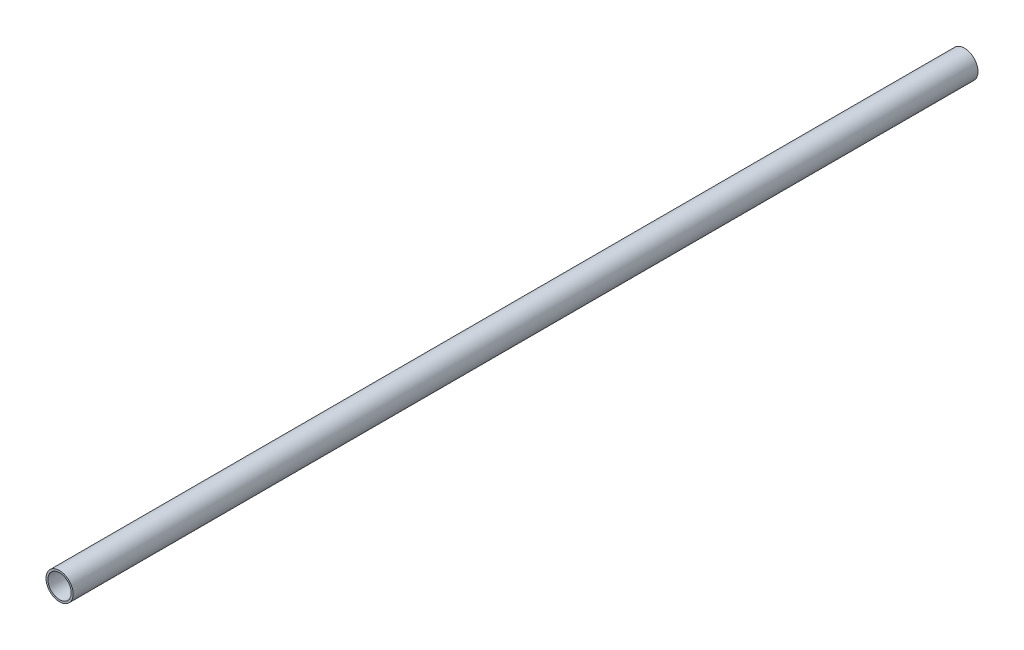
ISO-10303-21;
HEADER;
FILE_DESCRIPTION(('STEP AP214'),'2;1');
FILE_NAME('part.step','',(''),(''),'','','');
FILE_SCHEMA(('AUTOMOTIVE_DESIGN { 1 0 10303 214 1 1 1 1 }'));
ENDSEC;
DATA;
#1=APPLICATION_CONTEXT('core data for automotive mechanical design processes');
#2=APPLICATION_PROTOCOL_DEFINITION('international standard','automotive_design',2000,#1);
#3=PRODUCT_CONTEXT('',#1,'mechanical');
#4=PRODUCT('Part','Part','',(#3));
#5=PRODUCT_RELATED_PRODUCT_CATEGORY('part','',(#4));
#6=PRODUCT_DEFINITION_FORMATION('','',#4);
#7=PRODUCT_DEFINITION_CONTEXT('part definition',#1,'design');
#8=PRODUCT_DEFINITION('design','',#6,#7);
#9=PRODUCT_DEFINITION_SHAPE('','',#8);
#10=(LENGTH_UNIT() NAMED_UNIT(*) SI_UNIT(.MILLI.,.METRE.));
#11=(NAMED_UNIT(*) PLANE_ANGLE_UNIT() SI_UNIT($,.RADIAN.));
#12=(NAMED_UNIT(*) SI_UNIT($,.STERADIAN.) SOLID_ANGLE_UNIT());
#13=UNCERTAINTY_MEASURE_WITH_UNIT(LENGTH_MEASURE(1.E-05),#10,'distance_accuracy_value','');
#14=(GEOMETRIC_REPRESENTATION_CONTEXT(3) GLOBAL_UNCERTAINTY_ASSIGNED_CONTEXT((#13)) GLOBAL_UNIT_ASSIGNED_CONTEXT((#10,
#11,#12)) REPRESENTATION_CONTEXT('',''));
#15=CARTESIAN_POINT('',(0.,0.,0.));
#16=DIRECTION('',(0.,0.,1.));
#17=DIRECTION('',(1.,0.,0.));
#18=AXIS2_PLACEMENT_3D('',#15,#16,#17);
#19=CARTESIAN_POINT('',(0.,0.,120.));
#20=DIRECTION('',(0.,0.,1.));
#21=DIRECTION('',(1.,0.,0.));
#22=AXIS2_PLACEMENT_3D('',#19,#20,#21);
#23=PLANE('',#22);
#24=CARTESIAN_POINT('',(0.,0.,120.));
#25=DIRECTION('',(0.,0.,1.));
#26=DIRECTION('',(1.,0.,0.));
#27=AXIS2_PLACEMENT_3D('',#24,#25,#26);
#28=CIRCLE('',#27,1.8);
#29=CARTESIAN_POINT('',(1.8,0.,120.));
#30=VERTEX_POINT('',#29);
#31=EDGE_CURVE('E10',#30,#30,#28,.T.);
#32=ORIENTED_EDGE('',*,*,#31,.T.);
#33=EDGE_LOOP('',(#32));
#34=FACE_BOUND('',#33,.T.);
#35=CARTESIAN_POINT('',(0.,0.,120.));
#36=DIRECTION('',(0.,0.,1.));
#37=DIRECTION('',(1.,0.,0.));
#38=AXIS2_PLACEMENT_3D('',#35,#36,#37);
#39=CIRCLE('',#38,1.55);
#40=CARTESIAN_POINT('',(1.55,0.,120.));
#41=VERTEX_POINT('',#40);
#42=EDGE_CURVE('E43',#41,#41,#39,.T.);
#43=ORIENTED_EDGE('',*,*,#42,.F.);
#44=EDGE_LOOP('',(#43));
#45=FACE_BOUND('',#44,.T.);
#46=ADVANCED_FACE('F32',(#34,#45),#23,.T.);
#47=CARTESIAN_POINT('',(0.,0.,0.));
#48=DIRECTION('',(0.,0.,1.));
#49=DIRECTION('',(1.,0.,0.));
#50=AXIS2_PLACEMENT_3D('',#47,#48,#49);
#51=PLANE('',#50);
#52=CARTESIAN_POINT('',(0.,0.,0.));
#53=DIRECTION('',(0.,0.,1.));
#54=DIRECTION('',(1.,0.,0.));
#55=AXIS2_PLACEMENT_3D('',#52,#53,#54);
#56=CIRCLE('',#55,1.8);
#57=CARTESIAN_POINT('',(1.8,0.,0.));
#58=VERTEX_POINT('',#57);
#59=EDGE_CURVE('E36',#58,#58,#56,.T.);
#60=ORIENTED_EDGE('',*,*,#59,.F.);
#61=EDGE_LOOP('',(#60));
#62=FACE_BOUND('',#61,.T.);
#63=CARTESIAN_POINT('',(0.,0.,0.));
#64=DIRECTION('',(0.,0.,1.));
#65=DIRECTION('',(1.,0.,0.));
#66=AXIS2_PLACEMENT_3D('',#63,#64,#65);
#67=CIRCLE('',#66,1.55);
#68=CARTESIAN_POINT('',(1.55,0.,0.));
#69=VERTEX_POINT('',#68);
#70=EDGE_CURVE('E45',#69,#69,#67,.T.);
#71=ORIENTED_EDGE('',*,*,#70,.T.);
#72=EDGE_LOOP('',(#71));
#73=FACE_BOUND('',#72,.T.);
#74=ADVANCED_FACE('F55',(#62,#73),#51,.F.);
#75=CARTESIAN_POINT('',(0.,0.,120.));
#76=DIRECTION('',(0.,0.,-1.));
#77=DIRECTION('',(-1.,0.,0.));
#78=AXIS2_PLACEMENT_3D('',#75,#76,#77);
#79=CYLINDRICAL_SURFACE('',#78,1.8);
#80=ORIENTED_EDGE('',*,*,#31,.F.);
#81=EDGE_LOOP('',(#80));
#82=FACE_BOUND('',#81,.T.);
#83=ORIENTED_EDGE('',*,*,#59,.T.);
#84=EDGE_LOOP('',(#83));
#85=FACE_BOUND('',#84,.T.);
#86=ADVANCED_FACE('F34',(#82,#85),#79,.T.);
#87=CARTESIAN_POINT('',(0.,0.,120.));
#88=DIRECTION('',(0.,0.,-1.));
#89=DIRECTION('',(-1.,0.,0.));
#90=AXIS2_PLACEMENT_3D('',#87,#88,#89);
#91=CYLINDRICAL_SURFACE('',#90,1.55);
#92=ORIENTED_EDGE('',*,*,#42,.T.);
#93=EDGE_LOOP('',(#92));
#94=FACE_BOUND('',#93,.T.);
#95=ORIENTED_EDGE('',*,*,#70,.F.);
#96=EDGE_LOOP('',(#95));
#97=FACE_BOUND('',#96,.T.);
#98=ADVANCED_FACE('F51',(#94,#97),#91,.F.);
#99=CLOSED_SHELL('',(#46,#74,#86,#98));
#100=MANIFOLD_SOLID_BREP('B2',#99);
#101=ADVANCED_BREP_SHAPE_REPRESENTATION('',(#18,#100),#14);
#102=SHAPE_DEFINITION_REPRESENTATION(#9,#101);
ENDSEC;
END-ISO-10303-21;
